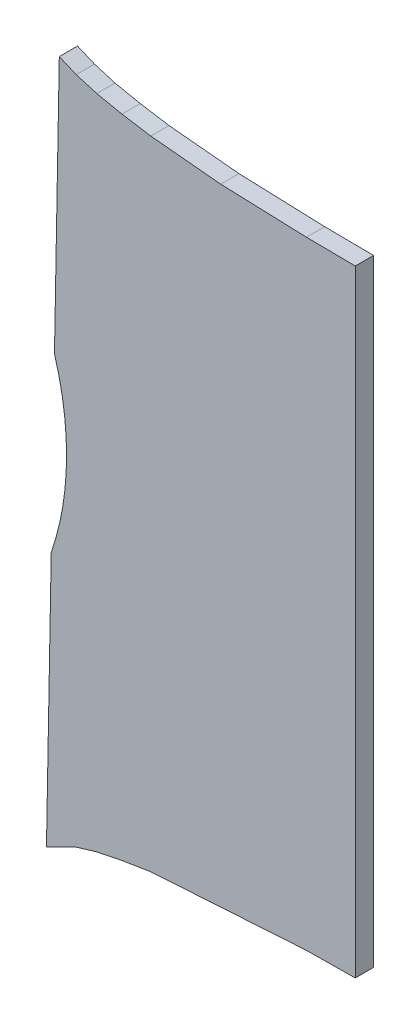
ISO-10303-21;
HEADER;
FILE_DESCRIPTION(('STEP AP214'),'2;1');
FILE_NAME('part.step','',(''),(''),'','','');
FILE_SCHEMA(('AUTOMOTIVE_DESIGN { 1 0 10303 214 1 1 1 1 }'));
ENDSEC;
DATA;
#1=APPLICATION_CONTEXT('core data for automotive mechanical design processes');
#2=APPLICATION_PROTOCOL_DEFINITION('international standard','automotive_design',2000,#1);
#3=PRODUCT_CONTEXT('',#1,'mechanical');
#4=PRODUCT('Part','Part','',(#3));
#5=PRODUCT_RELATED_PRODUCT_CATEGORY('part','',(#4));
#6=PRODUCT_DEFINITION_FORMATION('','',#4);
#7=PRODUCT_DEFINITION_CONTEXT('part definition',#1,'design');
#8=PRODUCT_DEFINITION('design','',#6,#7);
#9=PRODUCT_DEFINITION_SHAPE('','',#8);
#10=(LENGTH_UNIT() NAMED_UNIT(*) SI_UNIT(.MILLI.,.METRE.));
#11=(NAMED_UNIT(*) PLANE_ANGLE_UNIT() SI_UNIT($,.RADIAN.));
#12=(NAMED_UNIT(*) SI_UNIT($,.STERADIAN.) SOLID_ANGLE_UNIT());
#13=UNCERTAINTY_MEASURE_WITH_UNIT(LENGTH_MEASURE(1.E-05),#10,'distance_accuracy_value','');
#14=(GEOMETRIC_REPRESENTATION_CONTEXT(3) GLOBAL_UNCERTAINTY_ASSIGNED_CONTEXT((#13)) GLOBAL_UNIT_ASSIGNED_CONTEXT((#10,
#11,#12)) REPRESENTATION_CONTEXT('',''));
#15=CARTESIAN_POINT('',(0.,0.,0.));
#16=DIRECTION('',(0.,0.,1.));
#17=DIRECTION('',(1.,0.,0.));
#18=AXIS2_PLACEMENT_3D('',#15,#16,#17);
#19=CARTESIAN_POINT('',(97.8160018920898,69.9800033569336,0.));
#20=DIRECTION('',(-1.,0.,0.));
#21=DIRECTION('',(0.,1.,0.));
#22=AXIS2_PLACEMENT_3D('',#19,#20,#21);
#23=PLANE('',#22);
#24=DIRECTION('',(0.,1.,0.));
#25=VECTOR('',#24,1.);
#26=CARTESIAN_POINT('',(97.8160018920898,69.9800033569336,0.03556));
#27=LINE('',#26,#25);
#28=CARTESIAN_POINT('',(97.8160018920898,69.9800033569336,0.03556));
#29=VERTEX_POINT('',#28);
#30=CARTESIAN_POINT('',(97.8160018920898,71.1800003051758,0.03556));
#31=VERTEX_POINT('',#30);
#32=EDGE_CURVE('E11',#29,#31,#27,.T.);
#33=ORIENTED_EDGE('',*,*,#32,.F.);
#34=DIRECTION('',(0.,0.,1.));
#35=VECTOR('',#34,1.);
#36=CARTESIAN_POINT('',(97.8160018920898,69.9800033569336,0.));
#37=LINE('',#36,#35);
#38=CARTESIAN_POINT('',(97.8160018920898,69.9800033569336,0.));
#39=VERTEX_POINT('',#38);
#40=EDGE_CURVE('E24',#39,#29,#37,.T.);
#41=ORIENTED_EDGE('',*,*,#40,.F.);
#42=DIRECTION('',(0.,1.,0.));
#43=VECTOR('',#42,1.);
#44=CARTESIAN_POINT('',(97.8160018920898,69.9800033569336,0.));
#45=LINE('',#44,#43);
#46=CARTESIAN_POINT('',(97.8160018920898,71.1800003051758,0.));
#47=VERTEX_POINT('',#46);
#48=EDGE_CURVE('E281',#39,#47,#45,.T.);
#49=ORIENTED_EDGE('',*,*,#48,.T.);
#50=DIRECTION('',(0.,0.,1.));
#51=VECTOR('',#50,1.);
#52=CARTESIAN_POINT('',(97.8160018920898,71.1800003051758,0.));
#53=LINE('',#52,#51);
#54=EDGE_CURVE('E37',#47,#31,#53,.T.);
#55=ORIENTED_EDGE('',*,*,#54,.T.);
#56=EDGE_LOOP('',(#33,#41,#49,#55));
#57=FACE_BOUND('',#56,.T.);
#58=ADVANCED_FACE('F17',(#57),#23,.F.);
#59=CARTESIAN_POINT('',(97.7210006713867,69.9789962768555,0.));
#60=DIRECTION('',(-0.0106001111368589,0.999943817243692,0.));
#61=DIRECTION('',(0.999943817243692,0.0106001111368589,0.));
#62=AXIS2_PLACEMENT_3D('',#59,#60,#61);
#63=PLANE('',#62);
#64=DIRECTION('',(0.999943817243692,0.0106001111368589,0.));
#65=VECTOR('',#64,1.);
#66=CARTESIAN_POINT('',(97.7210006713867,69.9789962768555,0.03556));
#67=LINE('',#66,#65);
#68=CARTESIAN_POINT('',(97.7210006713867,69.9789962768555,0.03556));
#69=VERTEX_POINT('',#68);
#70=EDGE_CURVE('E277',#69,#29,#67,.T.);
#71=ORIENTED_EDGE('',*,*,#70,.F.);
#72=DIRECTION('',(0.,0.,1.));
#73=VECTOR('',#72,1.);
#74=CARTESIAN_POINT('',(97.7210006713867,69.9789962768555,0.));
#75=LINE('',#74,#73);
#76=CARTESIAN_POINT('',(97.7210006713867,69.9789962768555,0.));
#77=VERTEX_POINT('',#76);
#78=EDGE_CURVE('E275',#77,#69,#75,.T.);
#79=ORIENTED_EDGE('',*,*,#78,.F.);
#80=DIRECTION('',(0.999943817243692,0.0106001111368589,0.));
#81=VECTOR('',#80,1.);
#82=CARTESIAN_POINT('',(97.7210006713867,69.9789962768555,0.));
#83=LINE('',#82,#81);
#84=EDGE_CURVE('E273',#77,#39,#83,.T.);
#85=ORIENTED_EDGE('',*,*,#84,.T.);
#86=ORIENTED_EDGE('',*,*,#40,.T.);
#87=EDGE_LOOP('',(#71,#79,#85,#86));
#88=FACE_BOUND('',#87,.T.);
#89=ADVANCED_FACE('F284',(#88),#63,.F.);
#90=CARTESIAN_POINT('',(97.4179992675781,69.9599990844727,0.));
#91=DIRECTION('',(-0.0625738496276475,0.998040336530932,0.));
#92=DIRECTION('',(0.998040336530932,0.0625738496276475,0.));
#93=AXIS2_PLACEMENT_3D('',#90,#91,#92);
#94=PLANE('',#93);
#95=DIRECTION('',(0.998040336530932,0.0625738496276475,0.));
#96=VECTOR('',#95,1.);
#97=CARTESIAN_POINT('',(97.4179992675781,69.9599990844727,0.03556));
#98=LINE('',#97,#96);
#99=CARTESIAN_POINT('',(97.4179992675781,69.9599990844727,0.03556));
#100=VERTEX_POINT('',#99);
#101=EDGE_CURVE('E270',#100,#69,#98,.T.);
#102=ORIENTED_EDGE('',*,*,#101,.F.);
#103=DIRECTION('',(0.,0.,1.));
#104=VECTOR('',#103,1.);
#105=CARTESIAN_POINT('',(97.4179992675781,69.9599990844727,0.));
#106=LINE('',#105,#104);
#107=CARTESIAN_POINT('',(97.4179992675781,69.9599990844727,0.));
#108=VERTEX_POINT('',#107);
#109=EDGE_CURVE('E268',#108,#100,#106,.T.);
#110=ORIENTED_EDGE('',*,*,#109,.F.);
#111=DIRECTION('',(0.998040336530932,0.0625738496276475,0.));
#112=VECTOR('',#111,1.);
#113=CARTESIAN_POINT('',(97.4179992675781,69.9599990844727,0.));
#114=LINE('',#113,#112);
#115=EDGE_CURVE('E265',#108,#77,#114,.T.);
#116=ORIENTED_EDGE('',*,*,#115,.T.);
#117=ORIENTED_EDGE('',*,*,#78,.T.);
#118=EDGE_LOOP('',(#102,#110,#116,#117));
#119=FACE_BOUND('',#118,.T.);
#120=ADVANCED_FACE('F287',(#119),#94,.F.);
#121=CARTESIAN_POINT('',(97.3619995117188,69.9509963989258,0.));
#122=DIRECTION('',(-0.158724925844647,0.987322843813315,0.));
#123=DIRECTION('',(0.987322843813315,0.158724925844647,0.));
#124=AXIS2_PLACEMENT_3D('',#121,#122,#123);
#125=PLANE('',#124);
#126=DIRECTION('',(0.987322843813315,0.158724925844647,0.));
#127=VECTOR('',#126,1.);
#128=CARTESIAN_POINT('',(97.3619995117188,69.9509963989258,0.03556));
#129=LINE('',#128,#127);
#130=CARTESIAN_POINT('',(97.3619995117188,69.9509963989258,0.03556));
#131=VERTEX_POINT('',#130);
#132=EDGE_CURVE('E262',#131,#100,#129,.T.);
#133=ORIENTED_EDGE('',*,*,#132,.F.);
#134=DIRECTION('',(0.,0.,1.));
#135=VECTOR('',#134,1.);
#136=CARTESIAN_POINT('',(97.3619995117188,69.9509963989258,0.));
#137=LINE('',#136,#135);
#138=CARTESIAN_POINT('',(97.3619995117188,69.9509963989258,0.));
#139=VERTEX_POINT('',#138);
#140=EDGE_CURVE('E260',#139,#131,#137,.T.);
#141=ORIENTED_EDGE('',*,*,#140,.F.);
#142=DIRECTION('',(0.987322843813315,0.158724925844647,0.));
#143=VECTOR('',#142,1.);
#144=CARTESIAN_POINT('',(97.3619995117188,69.9509963989258,0.));
#145=LINE('',#144,#143);
#146=EDGE_CURVE('E257',#139,#108,#145,.T.);
#147=ORIENTED_EDGE('',*,*,#146,.T.);
#148=ORIENTED_EDGE('',*,*,#109,.T.);
#149=EDGE_LOOP('',(#133,#141,#147,#148));
#150=FACE_BOUND('',#149,.T.);
#151=ADVANCED_FACE('F292',(#150),#125,.F.);
#152=CARTESIAN_POINT('',(97.313003540039,69.9410018920898,0.));
#153=DIRECTION('',(-0.199870334238002,0.979822356088893,0.));
#154=DIRECTION('',(0.979822356088893,0.199870334238002,0.));
#155=AXIS2_PLACEMENT_3D('',#152,#153,#154);
#156=PLANE('',#155);
#157=DIRECTION('',(0.979822356088893,0.199870334238002,0.));
#158=VECTOR('',#157,1.);
#159=CARTESIAN_POINT('',(97.313003540039,69.9410018920898,0.03556));
#160=LINE('',#159,#158);
#161=CARTESIAN_POINT('',(97.313003540039,69.9410018920898,0.03556));
#162=VERTEX_POINT('',#161);
#163=EDGE_CURVE('E254',#162,#131,#160,.T.);
#164=ORIENTED_EDGE('',*,*,#163,.F.);
#165=DIRECTION('',(0.,0.,1.));
#166=VECTOR('',#165,1.);
#167=CARTESIAN_POINT('',(97.313003540039,69.9410018920898,0.));
#168=LINE('',#167,#166);
#169=CARTESIAN_POINT('',(97.313003540039,69.9410018920898,0.));
#170=VERTEX_POINT('',#169);
#171=EDGE_CURVE('E252',#170,#162,#168,.T.);
#172=ORIENTED_EDGE('',*,*,#171,.F.);
#173=DIRECTION('',(0.979822356088893,0.199870334238002,0.));
#174=VECTOR('',#173,1.);
#175=CARTESIAN_POINT('',(97.313003540039,69.9410018920898,0.));
#176=LINE('',#175,#174);
#177=EDGE_CURVE('E249',#170,#139,#176,.T.);
#178=ORIENTED_EDGE('',*,*,#177,.T.);
#179=ORIENTED_EDGE('',*,*,#140,.T.);
#180=EDGE_LOOP('',(#164,#172,#178,#179));
#181=FACE_BOUND('',#180,.T.);
#182=ADVANCED_FACE('F295',(#181),#156,.F.);
#183=CARTESIAN_POINT('',(97.2730026245117,69.9290008544922,0.));
#184=DIRECTION('',(-0.287364645680626,0.957821257027034,0.));
#185=DIRECTION('',(0.957821257027034,0.287364645680626,0.));
#186=AXIS2_PLACEMENT_3D('',#183,#184,#185);
#187=PLANE('',#186);
#188=DIRECTION('',(0.957821257027034,0.287364645680626,0.));
#189=VECTOR('',#188,1.);
#190=CARTESIAN_POINT('',(97.2730026245117,69.9290008544922,0.03556));
#191=LINE('',#190,#189);
#192=CARTESIAN_POINT('',(97.2730026245117,69.9290008544922,0.03556));
#193=VERTEX_POINT('',#192);
#194=EDGE_CURVE('E246',#193,#162,#191,.T.);
#195=ORIENTED_EDGE('',*,*,#194,.F.);
#196=DIRECTION('',(0.,0.,1.));
#197=VECTOR('',#196,1.);
#198=CARTESIAN_POINT('',(97.2730026245117,69.9290008544922,0.));
#199=LINE('',#198,#197);
#200=CARTESIAN_POINT('',(97.2730026245117,69.9290008544922,0.));
#201=VERTEX_POINT('',#200);
#202=EDGE_CURVE('E244',#201,#193,#199,.T.);
#203=ORIENTED_EDGE('',*,*,#202,.F.);
#204=DIRECTION('',(0.957821257027034,0.287364645680626,0.));
#205=VECTOR('',#204,1.);
#206=CARTESIAN_POINT('',(97.2730026245117,69.9290008544922,0.));
#207=LINE('',#206,#205);
#208=EDGE_CURVE('E241',#201,#170,#207,.T.);
#209=ORIENTED_EDGE('',*,*,#208,.T.);
#210=ORIENTED_EDGE('',*,*,#171,.T.);
#211=EDGE_LOOP('',(#195,#203,#209,#210));
#212=FACE_BOUND('',#211,.T.);
#213=ADVANCED_FACE('F300',(#212),#187,.F.);
#214=CARTESIAN_POINT('',(97.2149963378906,69.9000015258789,0.));
#215=DIRECTION('',(-0.44716653710283,0.894450718651097,0.));
#216=DIRECTION('',(0.894450718651097,0.44716653710283,0.));
#217=AXIS2_PLACEMENT_3D('',#214,#215,#216);
#218=PLANE('',#217);
#219=DIRECTION('',(0.894450718651097,0.44716653710283,0.));
#220=VECTOR('',#219,1.);
#221=CARTESIAN_POINT('',(97.2149963378906,69.9000015258789,0.03556));
#222=LINE('',#221,#220);
#223=CARTESIAN_POINT('',(97.2149963378906,69.9000015258789,0.03556));
#224=VERTEX_POINT('',#223);
#225=EDGE_CURVE('E238',#224,#193,#222,.T.);
#226=ORIENTED_EDGE('',*,*,#225,.F.);
#227=DIRECTION('',(0.,0.,1.));
#228=VECTOR('',#227,1.);
#229=CARTESIAN_POINT('',(97.2149963378906,69.9000015258789,0.));
#230=LINE('',#229,#228);
#231=CARTESIAN_POINT('',(97.2149963378906,69.9000015258789,0.));
#232=VERTEX_POINT('',#231);
#233=EDGE_CURVE('E236',#232,#224,#230,.T.);
#234=ORIENTED_EDGE('',*,*,#233,.F.);
#235=DIRECTION('',(0.894450718651097,0.44716653710283,0.));
#236=VECTOR('',#235,1.);
#237=CARTESIAN_POINT('',(97.2149963378906,69.9000015258789,0.));
#238=LINE('',#237,#236);
#239=EDGE_CURVE('E233',#232,#201,#238,.T.);
#240=ORIENTED_EDGE('',*,*,#239,.T.);
#241=ORIENTED_EDGE('',*,*,#202,.T.);
#242=EDGE_LOOP('',(#226,#234,#240,#241));
#243=FACE_BOUND('',#242,.T.);
#244=ADVANCED_FACE('F303',(#243),#218,.F.);
#245=CARTESIAN_POINT('',(97.2243159759027,70.4013679050111,0.));
#246=DIRECTION('',(0.999827278998106,-0.0185852675860322,0.));
#247=DIRECTION('',(-0.0185852675860322,-0.999827278998106,0.));
#248=AXIS2_PLACEMENT_3D('',#245,#246,#247);
#249=PLANE('',#248);
#250=DIRECTION('',(-0.0185852675860322,-0.999827278998106,0.));
#251=VECTOR('',#250,1.);
#252=CARTESIAN_POINT('',(97.2399978637695,71.245002746582,0.03556));
#253=LINE('',#252,#251);
#254=CARTESIAN_POINT('',(97.2243159759027,70.4013679050111,0.03556));
#255=VERTEX_POINT('',#254);
#256=EDGE_CURVE('E230',#255,#224,#253,.T.);
#257=ORIENTED_EDGE('',*,*,#256,.F.);
#258=DIRECTION('',(0.,0.,1.));
#259=VECTOR('',#258,1.);
#260=CARTESIAN_POINT('',(97.2243159759027,70.4013679050111,0.));
#261=LINE('',#260,#259);
#262=CARTESIAN_POINT('',(97.2243159759027,70.4013679050111,0.));
#263=VERTEX_POINT('',#262);
#264=EDGE_CURVE('E228',#263,#255,#261,.T.);
#265=ORIENTED_EDGE('',*,*,#264,.F.);
#266=DIRECTION('',(-0.0185852675860322,-0.999827278998106,0.));
#267=VECTOR('',#266,1.);
#268=CARTESIAN_POINT('',(97.2399978637695,71.245002746582,0.));
#269=LINE('',#268,#267);
#270=EDGE_CURVE('E225',#263,#232,#269,.T.);
#271=ORIENTED_EDGE('',*,*,#270,.T.);
#272=ORIENTED_EDGE('',*,*,#233,.T.);
#273=EDGE_LOOP('',(#257,#265,#271,#272));
#274=FACE_BOUND('',#273,.T.);
#275=ADVANCED_FACE('F308',(#274),#249,.F.);
#276=CARTESIAN_POINT('',(96.70415,70.5800468,0.));
#277=DIRECTION('',(0.,0.,-1.));
#278=DIRECTION('',(1.,0.,0.));
#279=AXIS2_PLACEMENT_3D('',#276,#277,#278);
#280=CYLINDRICAL_SURFACE('',#279,0.5499989);
#281=ORIENTED_EDGE('',*,*,#264,.T.);
#282=CARTESIAN_POINT('',(96.70415,70.5800468,0.03556));
#283=DIRECTION('',(0.,0.,1.));
#284=DIRECTION('',(1.,0.,0.));
#285=AXIS2_PLACEMENT_3D('',#282,#283,#284);
#286=CIRCLE('',#285,0.5499989);
#287=CARTESIAN_POINT('',(97.2541489,70.5800468,0.03556));
#288=VERTEX_POINT('',#287);
#289=EDGE_CURVE('E222',#255,#288,#286,.T.);
#290=ORIENTED_EDGE('',*,*,#289,.T.);
#291=DIRECTION('',(0.,0.,1.));
#292=VECTOR('',#291,1.);
#293=CARTESIAN_POINT('',(97.2541489,70.5800468,0.));
#294=LINE('',#293,#292);
#295=CARTESIAN_POINT('',(97.2541489,70.5800468,0.));
#296=VERTEX_POINT('',#295);
#297=EDGE_CURVE('E220',#296,#288,#294,.T.);
#298=ORIENTED_EDGE('',*,*,#297,.F.);
#299=CARTESIAN_POINT('',(96.70415,70.5800468,0.));
#300=DIRECTION('',(0.,0.,1.));
#301=DIRECTION('',(1.,0.,0.));
#302=AXIS2_PLACEMENT_3D('',#299,#300,#301);
#303=CIRCLE('',#302,0.5499989);
#304=EDGE_CURVE('E217',#263,#296,#303,.T.);
#305=ORIENTED_EDGE('',*,*,#304,.F.);
#306=EDGE_LOOP('',(#281,#290,#298,#305));
#307=FACE_BOUND('',#306,.T.);
#308=ADVANCED_FACE('F311',(#307),#280,.F.);
#309=CARTESIAN_POINT('',(96.70415,70.5800468,0.));
#310=DIRECTION('',(0.,0.,-1.));
#311=DIRECTION('',(1.,0.,0.));
#312=AXIS2_PLACEMENT_3D('',#309,#310,#311);
#313=CYLINDRICAL_SURFACE('',#312,0.5499989);
#314=ORIENTED_EDGE('',*,*,#297,.T.);
#315=CARTESIAN_POINT('',(96.70415,70.5800468,0.03556));
#316=DIRECTION('',(0.,0.,1.));
#317=DIRECTION('',(1.,0.,0.));
#318=AXIS2_PLACEMENT_3D('',#315,#316,#317);
#319=CIRCLE('',#318,0.5499989);
#320=CARTESIAN_POINT('',(97.230597075593,70.7392707510904,0.03556));
#321=VERTEX_POINT('',#320);
#322=EDGE_CURVE('E214',#288,#321,#319,.T.);
#323=ORIENTED_EDGE('',*,*,#322,.T.);
#324=DIRECTION('',(0.,0.,1.));
#325=VECTOR('',#324,1.);
#326=CARTESIAN_POINT('',(97.230597075593,70.7392707510904,0.));
#327=LINE('',#326,#325);
#328=CARTESIAN_POINT('',(97.230597075593,70.7392707510904,0.));
#329=VERTEX_POINT('',#328);
#330=EDGE_CURVE('E212',#329,#321,#327,.T.);
#331=ORIENTED_EDGE('',*,*,#330,.F.);
#332=EDGE_CURVE('E211',#296,#329,#303,.T.);
#333=ORIENTED_EDGE('',*,*,#332,.F.);
#334=EDGE_LOOP('',(#314,#323,#331,#333));
#335=FACE_BOUND('',#334,.T.);
#336=ADVANCED_FACE('F318',(#335),#313,.F.);
#337=CARTESIAN_POINT('',(97.2399978637695,71.245002746582,0.));
#338=DIRECTION('',(0.999827278998106,-0.0185852675860322,0.));
#339=DIRECTION('',(-0.0185852675860322,-0.999827278998106,0.));
#340=AXIS2_PLACEMENT_3D('',#337,#338,#339);
#341=PLANE('',#340);
#342=DIRECTION('',(-0.0185852675860322,-0.999827278998106,0.));
#343=VECTOR('',#342,1.);
#344=CARTESIAN_POINT('',(97.2399978637695,71.245002746582,0.03556));
#345=LINE('',#344,#343);
#346=CARTESIAN_POINT('',(97.2399978637695,71.245002746582,0.03556));
#347=VERTEX_POINT('',#346);
#348=EDGE_CURVE('E208',#347,#321,#345,.T.);
#349=ORIENTED_EDGE('',*,*,#348,.F.);
#350=DIRECTION('',(0.,0.,1.));
#351=VECTOR('',#350,1.);
#352=CARTESIAN_POINT('',(97.2399978637695,71.245002746582,0.));
#353=LINE('',#352,#351);
#354=CARTESIAN_POINT('',(97.2399978637695,71.245002746582,0.));
#355=VERTEX_POINT('',#354);
#356=EDGE_CURVE('E206',#355,#347,#353,.T.);
#357=ORIENTED_EDGE('',*,*,#356,.F.);
#358=EDGE_CURVE('E205',#355,#329,#269,.T.);
#359=ORIENTED_EDGE('',*,*,#358,.T.);
#360=ORIENTED_EDGE('',*,*,#330,.T.);
#361=EDGE_LOOP('',(#349,#357,#359,#360));
#362=FACE_BOUND('',#361,.T.);
#363=ADVANCED_FACE('F321',(#362),#341,.F.);
#364=CARTESIAN_POINT('',(97.2730026245117,71.2310028076172,0.));
#365=DIRECTION('',(-0.390500660579544,-0.920602647230031,0.));
#366=DIRECTION('',(-0.920602647230031,0.390500660579544,0.));
#367=AXIS2_PLACEMENT_3D('',#364,#365,#366);
#368=PLANE('',#367);
#369=DIRECTION('',(-0.920602647230031,0.390500660579544,0.));
#370=VECTOR('',#369,1.);
#371=CARTESIAN_POINT('',(97.2730026245117,71.2310028076172,0.03556));
#372=LINE('',#371,#370);
#373=CARTESIAN_POINT('',(97.2730026245117,71.2310028076172,0.03556));
#374=VERTEX_POINT('',#373);
#375=EDGE_CURVE('E202',#374,#347,#372,.T.);
#376=ORIENTED_EDGE('',*,*,#375,.F.);
#377=DIRECTION('',(0.,0.,1.));
#378=VECTOR('',#377,1.);
#379=CARTESIAN_POINT('',(97.2730026245117,71.2310028076172,0.));
#380=LINE('',#379,#378);
#381=CARTESIAN_POINT('',(97.2730026245117,71.2310028076172,0.));
#382=VERTEX_POINT('',#381);
#383=EDGE_CURVE('E200',#382,#374,#380,.T.);
#384=ORIENTED_EDGE('',*,*,#383,.F.);
#385=DIRECTION('',(-0.920602647230031,0.390500660579544,0.));
#386=VECTOR('',#385,1.);
#387=CARTESIAN_POINT('',(97.2730026245117,71.2310028076172,0.));
#388=LINE('',#387,#386);
#389=EDGE_CURVE('E197',#382,#355,#388,.T.);
#390=ORIENTED_EDGE('',*,*,#389,.T.);
#391=ORIENTED_EDGE('',*,*,#356,.T.);
#392=EDGE_LOOP('',(#376,#384,#390,#391));
#393=FACE_BOUND('',#392,.T.);
#394=ADVANCED_FACE('F326',(#393),#368,.F.);
#395=CARTESIAN_POINT('',(97.313003540039,71.2190017700195,0.));
#396=DIRECTION('',(-0.287364645680626,-0.957821257027034,0.));
#397=DIRECTION('',(-0.957821257027034,0.287364645680626,0.));
#398=AXIS2_PLACEMENT_3D('',#395,#396,#397);
#399=PLANE('',#398);
#400=DIRECTION('',(-0.957821257027034,0.287364645680626,0.));
#401=VECTOR('',#400,1.);
#402=CARTESIAN_POINT('',(97.313003540039,71.2190017700195,0.03556));
#403=LINE('',#402,#401);
#404=CARTESIAN_POINT('',(97.313003540039,71.2190017700195,0.03556));
#405=VERTEX_POINT('',#404);
#406=EDGE_CURVE('E194',#405,#374,#403,.T.);
#407=ORIENTED_EDGE('',*,*,#406,.F.);
#408=DIRECTION('',(0.,0.,1.));
#409=VECTOR('',#408,1.);
#410=CARTESIAN_POINT('',(97.313003540039,71.2190017700195,0.));
#411=LINE('',#410,#409);
#412=CARTESIAN_POINT('',(97.313003540039,71.2190017700195,0.));
#413=VERTEX_POINT('',#412);
#414=EDGE_CURVE('E192',#413,#405,#411,.T.);
#415=ORIENTED_EDGE('',*,*,#414,.F.);
#416=DIRECTION('',(-0.957821257027034,0.287364645680626,0.));
#417=VECTOR('',#416,1.);
#418=CARTESIAN_POINT('',(97.313003540039,71.2190017700195,0.));
#419=LINE('',#418,#417);
#420=EDGE_CURVE('E189',#413,#382,#419,.T.);
#421=ORIENTED_EDGE('',*,*,#420,.T.);
#422=ORIENTED_EDGE('',*,*,#383,.T.);
#423=EDGE_LOOP('',(#407,#415,#421,#422));
#424=FACE_BOUND('',#423,.T.);
#425=ADVANCED_FACE('F329',(#424),#399,.F.);
#426=CARTESIAN_POINT('',(97.3619995117188,71.2089996337891,0.));
#427=DIRECTION('',(-0.200016805310508,-0.979792466593502,0.));
#428=DIRECTION('',(-0.979792466593502,0.200016805310508,0.));
#429=AXIS2_PLACEMENT_3D('',#426,#427,#428);
#430=PLANE('',#429);
#431=DIRECTION('',(-0.979792466593502,0.200016805310508,0.));
#432=VECTOR('',#431,1.);
#433=CARTESIAN_POINT('',(97.3619995117188,71.2089996337891,0.03556));
#434=LINE('',#433,#432);
#435=CARTESIAN_POINT('',(97.3619995117188,71.2089996337891,0.03556));
#436=VERTEX_POINT('',#435);
#437=EDGE_CURVE('E186',#436,#405,#434,.T.);
#438=ORIENTED_EDGE('',*,*,#437,.F.);
#439=DIRECTION('',(0.,0.,1.));
#440=VECTOR('',#439,1.);
#441=CARTESIAN_POINT('',(97.3619995117188,71.2089996337891,0.));
#442=LINE('',#441,#440);
#443=CARTESIAN_POINT('',(97.3619995117188,71.2089996337891,0.));
#444=VERTEX_POINT('',#443);
#445=EDGE_CURVE('E184',#444,#436,#442,.T.);
#446=ORIENTED_EDGE('',*,*,#445,.F.);
#447=DIRECTION('',(-0.979792466593502,0.200016805310508,0.));
#448=VECTOR('',#447,1.);
#449=CARTESIAN_POINT('',(97.3619995117188,71.2089996337891,0.));
#450=LINE('',#449,#448);
#451=EDGE_CURVE('E181',#444,#413,#450,.T.);
#452=ORIENTED_EDGE('',*,*,#451,.T.);
#453=ORIENTED_EDGE('',*,*,#414,.T.);
#454=EDGE_LOOP('',(#438,#446,#452,#453));
#455=FACE_BOUND('',#454,.T.);
#456=ADVANCED_FACE('F333',(#455),#430,.F.);
#457=CARTESIAN_POINT('',(97.4179992675781,71.1999969482422,0.));
#458=DIRECTION('',(-0.158724925844647,-0.987322843813315,0.));
#459=DIRECTION('',(-0.987322843813315,0.158724925844647,0.));
#460=AXIS2_PLACEMENT_3D('',#457,#458,#459);
#461=PLANE('',#460);
#462=DIRECTION('',(-0.987322843813315,0.158724925844647,0.));
#463=VECTOR('',#462,1.);
#464=CARTESIAN_POINT('',(97.4179992675781,71.1999969482422,0.03556));
#465=LINE('',#464,#463);
#466=CARTESIAN_POINT('',(97.4179992675781,71.1999969482422,0.03556));
#467=VERTEX_POINT('',#466);
#468=EDGE_CURVE('E178',#467,#436,#465,.T.);
#469=ORIENTED_EDGE('',*,*,#468,.F.);
#470=DIRECTION('',(0.,0.,1.));
#471=VECTOR('',#470,1.);
#472=CARTESIAN_POINT('',(97.4179992675781,71.1999969482422,0.));
#473=LINE('',#472,#471);
#474=CARTESIAN_POINT('',(97.4179992675781,71.1999969482422,0.));
#475=VERTEX_POINT('',#474);
#476=EDGE_CURVE('E176',#475,#467,#473,.T.);
#477=ORIENTED_EDGE('',*,*,#476,.F.);
#478=DIRECTION('',(-0.987322843813315,0.158724925844647,0.));
#479=VECTOR('',#478,1.);
#480=CARTESIAN_POINT('',(97.4179992675781,71.1999969482422,0.));
#481=LINE('',#480,#479);
#482=EDGE_CURVE('E173',#475,#444,#481,.T.);
#483=ORIENTED_EDGE('',*,*,#482,.T.);
#484=ORIENTED_EDGE('',*,*,#445,.T.);
#485=EDGE_LOOP('',(#469,#477,#483,#484));
#486=FACE_BOUND('',#485,.T.);
#487=ADVANCED_FACE('F336',(#486),#461,.F.);
#488=CARTESIAN_POINT('',(97.5540008544922,71.1869964599609,0.));
#489=DIRECTION('',(-0.0951569465430121,-0.99546228232144,0.));
#490=DIRECTION('',(-0.99546228232144,0.0951569465430121,0.));
#491=AXIS2_PLACEMENT_3D('',#488,#489,#490);
#492=PLANE('',#491);
#493=DIRECTION('',(-0.99546228232144,0.0951569465430121,0.));
#494=VECTOR('',#493,1.);
#495=CARTESIAN_POINT('',(97.5540008544922,71.1869964599609,0.03556));
#496=LINE('',#495,#494);
#497=CARTESIAN_POINT('',(97.5540008544922,71.1869964599609,0.03556));
#498=VERTEX_POINT('',#497);
#499=EDGE_CURVE('E170',#498,#467,#496,.T.);
#500=ORIENTED_EDGE('',*,*,#499,.F.);
#501=DIRECTION('',(0.,0.,1.));
#502=VECTOR('',#501,1.);
#503=CARTESIAN_POINT('',(97.5540008544922,71.1869964599609,0.));
#504=LINE('',#503,#502);
#505=CARTESIAN_POINT('',(97.5540008544922,71.1869964599609,0.));
#506=VERTEX_POINT('',#505);
#507=EDGE_CURVE('E168',#506,#498,#504,.T.);
#508=ORIENTED_EDGE('',*,*,#507,.F.);
#509=DIRECTION('',(-0.99546228232144,0.0951569465430121,0.));
#510=VECTOR('',#509,1.);
#511=CARTESIAN_POINT('',(97.5540008544922,71.1869964599609,0.));
#512=LINE('',#511,#510);
#513=EDGE_CURVE('E159',#506,#475,#512,.T.);
#514=ORIENTED_EDGE('',*,*,#513,.T.);
#515=ORIENTED_EDGE('',*,*,#476,.T.);
#516=EDGE_LOOP('',(#500,#508,#514,#515));
#517=FACE_BOUND('',#516,.T.);
#518=ADVANCED_FACE('F339',(#517),#492,.F.);
#519=CARTESIAN_POINT('',(97.7210006713867,71.1809997558594,0.));
#520=DIRECTION('',(-0.0358853190556377,-0.999355914515082,0.));
#521=DIRECTION('',(-0.999355914515082,0.0358853190556377,0.));
#522=AXIS2_PLACEMENT_3D('',#519,#520,#521);
#523=PLANE('',#522);
#524=DIRECTION('',(-0.999355914515082,0.0358853190556377,0.));
#525=VECTOR('',#524,1.);
#526=CARTESIAN_POINT('',(97.7210006713867,71.1809997558594,0.03556));
#527=LINE('',#526,#525);
#528=CARTESIAN_POINT('',(97.7210006713867,71.1809997558594,0.03556));
#529=VERTEX_POINT('',#528);
#530=EDGE_CURVE('E145',#529,#498,#527,.T.);
#531=ORIENTED_EDGE('',*,*,#530,.F.);
#532=DIRECTION('',(0.,0.,1.));
#533=VECTOR('',#532,1.);
#534=CARTESIAN_POINT('',(97.7210006713867,71.1809997558594,0.));
#535=LINE('',#534,#533);
#536=CARTESIAN_POINT('',(97.7210006713867,71.1809997558594,0.));
#537=VERTEX_POINT('',#536);
#538=EDGE_CURVE('E140',#537,#529,#535,.T.);
#539=ORIENTED_EDGE('',*,*,#538,.F.);
#540=DIRECTION('',(-0.999355914515082,0.0358853190556377,0.));
#541=VECTOR('',#540,1.);
#542=CARTESIAN_POINT('',(97.7210006713867,71.1809997558594,0.));
#543=LINE('',#542,#541);
#544=EDGE_CURVE('E143',#537,#506,#543,.T.);
#545=ORIENTED_EDGE('',*,*,#544,.T.);
#546=ORIENTED_EDGE('',*,*,#507,.T.);
#547=EDGE_LOOP('',(#531,#539,#545,#546));
#548=FACE_BOUND('',#547,.T.);
#549=ADVANCED_FACE('F142',(#548),#523,.F.);
#550=CARTESIAN_POINT('',(97.8160018920898,71.1800003051758,0.));
#551=DIRECTION('',(-0.010519816185477,-0.999944665202742,0.));
#552=DIRECTION('',(-0.999944665202742,0.010519816185477,0.));
#553=AXIS2_PLACEMENT_3D('',#550,#551,#552);
#554=PLANE('',#553);
#555=DIRECTION('',(-0.999944665202742,0.010519816185477,0.));
#556=VECTOR('',#555,1.);
#557=CARTESIAN_POINT('',(97.8160018920898,71.1800003051758,0.03556));
#558=LINE('',#557,#556);
#559=EDGE_CURVE('E160',#31,#529,#558,.T.);
#560=ORIENTED_EDGE('',*,*,#559,.F.);
#561=ORIENTED_EDGE('',*,*,#54,.F.);
#562=DIRECTION('',(-0.999944665202742,0.010519816185477,0.));
#563=VECTOR('',#562,1.);
#564=CARTESIAN_POINT('',(97.8160018920898,71.1800003051758,0.));
#565=LINE('',#564,#563);
#566=EDGE_CURVE('E156',#47,#537,#565,.T.);
#567=ORIENTED_EDGE('',*,*,#566,.T.);
#568=ORIENTED_EDGE('',*,*,#538,.T.);
#569=EDGE_LOOP('',(#560,#561,#567,#568));
#570=FACE_BOUND('',#569,.T.);
#571=ADVANCED_FACE('F162',(#570),#554,.F.);
#572=CARTESIAN_POINT('',(97.8160018920898,71.1800003051758,0.));
#573=DIRECTION('',(0.,0.,1.));
#574=DIRECTION('',(1.,0.,0.));
#575=AXIS2_PLACEMENT_3D('',#572,#573,#574);
#576=PLANE('',#575);
#577=ORIENTED_EDGE('',*,*,#566,.F.);
#578=ORIENTED_EDGE('',*,*,#48,.F.);
#579=ORIENTED_EDGE('',*,*,#84,.F.);
#580=ORIENTED_EDGE('',*,*,#115,.F.);
#581=ORIENTED_EDGE('',*,*,#146,.F.);
#582=ORIENTED_EDGE('',*,*,#177,.F.);
#583=ORIENTED_EDGE('',*,*,#208,.F.);
#584=ORIENTED_EDGE('',*,*,#239,.F.);
#585=ORIENTED_EDGE('',*,*,#270,.F.);
#586=ORIENTED_EDGE('',*,*,#304,.T.);
#587=ORIENTED_EDGE('',*,*,#332,.T.);
#588=ORIENTED_EDGE('',*,*,#358,.F.);
#589=ORIENTED_EDGE('',*,*,#389,.F.);
#590=ORIENTED_EDGE('',*,*,#420,.F.);
#591=ORIENTED_EDGE('',*,*,#451,.F.);
#592=ORIENTED_EDGE('',*,*,#482,.F.);
#593=ORIENTED_EDGE('',*,*,#513,.F.);
#594=ORIENTED_EDGE('',*,*,#544,.F.);
#595=EDGE_LOOP('',(#577,#578,#579,#580,#581,#582,#583,#584,#585,#586,#587,#588,#589,#590,#591,
#592,#593,#594));
#596=FACE_BOUND('',#595,.T.);
#597=ADVANCED_FACE('F154',(#596),#576,.F.);
#598=CARTESIAN_POINT('',(97.8160018920898,71.1800003051758,0.03556));
#599=DIRECTION('',(0.,0.,1.));
#600=DIRECTION('',(1.,0.,0.));
#601=AXIS2_PLACEMENT_3D('',#598,#599,#600);
#602=PLANE('',#601);
#603=ORIENTED_EDGE('',*,*,#32,.T.);
#604=ORIENTED_EDGE('',*,*,#559,.T.);
#605=ORIENTED_EDGE('',*,*,#530,.T.);
#606=ORIENTED_EDGE('',*,*,#499,.T.);
#607=ORIENTED_EDGE('',*,*,#468,.T.);
#608=ORIENTED_EDGE('',*,*,#437,.T.);
#609=ORIENTED_EDGE('',*,*,#406,.T.);
#610=ORIENTED_EDGE('',*,*,#375,.T.);
#611=ORIENTED_EDGE('',*,*,#348,.T.);
#612=ORIENTED_EDGE('',*,*,#322,.F.);
#613=ORIENTED_EDGE('',*,*,#289,.F.);
#614=ORIENTED_EDGE('',*,*,#256,.T.);
#615=ORIENTED_EDGE('',*,*,#225,.T.);
#616=ORIENTED_EDGE('',*,*,#194,.T.);
#617=ORIENTED_EDGE('',*,*,#163,.T.);
#618=ORIENTED_EDGE('',*,*,#132,.T.);
#619=ORIENTED_EDGE('',*,*,#101,.T.);
#620=ORIENTED_EDGE('',*,*,#70,.T.);
#621=EDGE_LOOP('',(#603,#604,#605,#606,#607,#608,#609,#610,#611,#612,#613,#614,#615,#616,#617,
#618,#619,#620));
#622=FACE_BOUND('',#621,.T.);
#623=ADVANCED_FACE('F341',(#622),#602,.T.);
#624=CLOSED_SHELL('',(#58,#89,#120,#151,#182,#213,#244,#275,#308,#336,#363,#394,#425,#456,#487,
#518,#549,#571,#597,#623));
#625=MANIFOLD_SOLID_BREP('B1',#624);
#626=ADVANCED_BREP_SHAPE_REPRESENTATION('',(#18,#625),#14);
#627=SHAPE_DEFINITION_REPRESENTATION(#9,#626);
ENDSEC;
END-ISO-10303-21;
